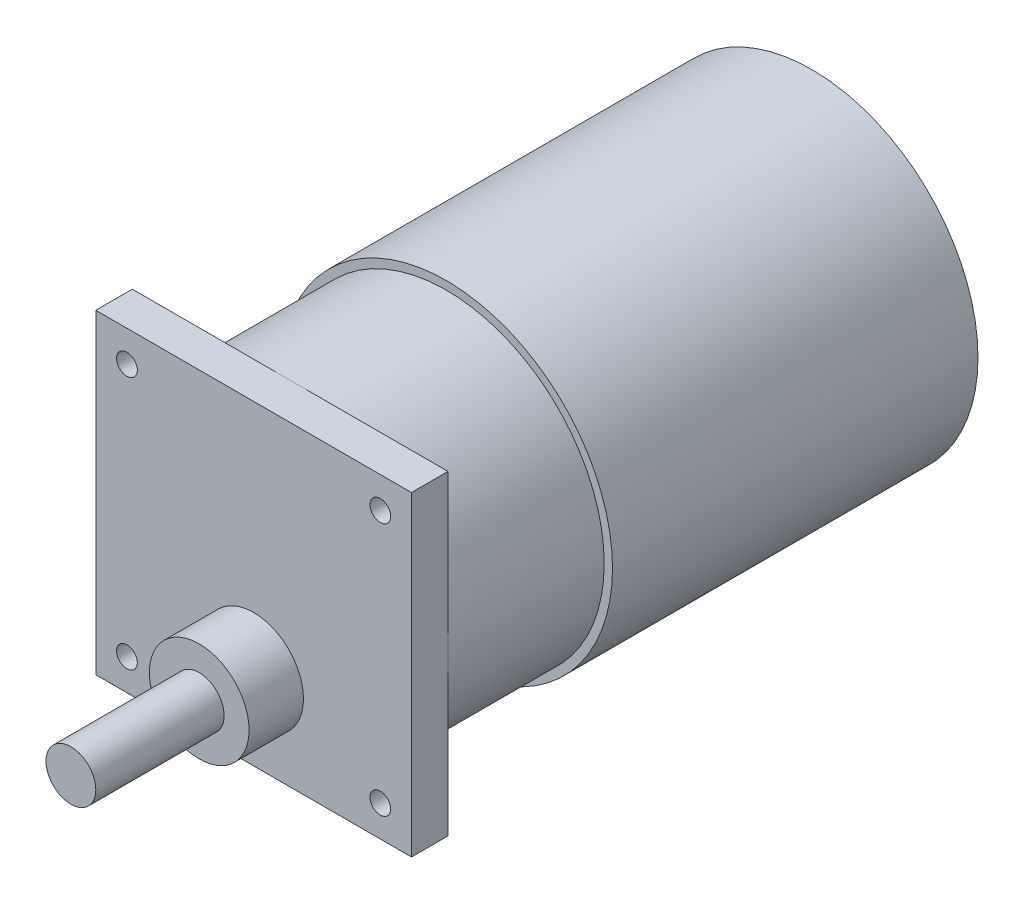
ISO-10303-21;
HEADER;
FILE_DESCRIPTION(('STEP AP214'),'2;1');
FILE_NAME('part.step','',(''),(''),'','','');
FILE_SCHEMA(('AUTOMOTIVE_DESIGN { 1 0 10303 214 1 1 1 1 }'));
ENDSEC;
DATA;
#1=APPLICATION_CONTEXT('core data for automotive mechanical design processes');
#2=APPLICATION_PROTOCOL_DEFINITION('international standard','automotive_design',2000,#1);
#3=PRODUCT_CONTEXT('',#1,'mechanical');
#4=PRODUCT('Part','Part','',(#3));
#5=PRODUCT_RELATED_PRODUCT_CATEGORY('part','',(#4));
#6=PRODUCT_DEFINITION_FORMATION('','',#4);
#7=PRODUCT_DEFINITION_CONTEXT('part definition',#1,'design');
#8=PRODUCT_DEFINITION('design','',#6,#7);
#9=PRODUCT_DEFINITION_SHAPE('','',#8);
#10=(LENGTH_UNIT() NAMED_UNIT(*) SI_UNIT(.MILLI.,.METRE.));
#11=(NAMED_UNIT(*) PLANE_ANGLE_UNIT() SI_UNIT($,.RADIAN.));
#12=(NAMED_UNIT(*) SI_UNIT($,.STERADIAN.) SOLID_ANGLE_UNIT());
#13=UNCERTAINTY_MEASURE_WITH_UNIT(LENGTH_MEASURE(1.E-05),#10,'distance_accuracy_value','');
#14=(GEOMETRIC_REPRESENTATION_CONTEXT(3) GLOBAL_UNCERTAINTY_ASSIGNED_CONTEXT((#13)) GLOBAL_UNIT_ASSIGNED_CONTEXT((#10,
#11,#12)) REPRESENTATION_CONTEXT('',''));
#15=CARTESIAN_POINT('',(0.,0.,0.));
#16=DIRECTION('',(0.,0.,1.));
#17=DIRECTION('',(1.,0.,0.));
#18=AXIS2_PLACEMENT_3D('',#15,#16,#17);
#19=CARTESIAN_POINT('',(0.,-9.,73.75));
#20=DIRECTION('',(0.,0.,1.));
#21=DIRECTION('',(1.,0.,0.));
#22=AXIS2_PLACEMENT_3D('',#19,#20,#21);
#23=PLANE('',#22);
#24=CARTESIAN_POINT('',(0.,-9.,73.75));
#25=DIRECTION('',(0.,0.,1.));
#26=DIRECTION('',(1.,0.,0.));
#27=AXIS2_PLACEMENT_3D('',#24,#25,#26);
#28=CIRCLE('',#27,6.);
#29=CARTESIAN_POINT('',(6.,-9.,73.75));
#30=VERTEX_POINT('',#29);
#31=EDGE_CURVE('E179',#30,#30,#28,.T.);
#32=ORIENTED_EDGE('',*,*,#31,.T.);
#33=EDGE_LOOP('',(#32));
#34=FACE_BOUND('',#33,.T.);
#35=CARTESIAN_POINT('',(0.,-9.,73.75));
#36=DIRECTION('',(0.,0.,1.));
#37=DIRECTION('',(1.,0.,0.));
#38=AXIS2_PLACEMENT_3D('',#35,#36,#37);
#39=CIRCLE('',#38,3.);
#40=CARTESIAN_POINT('',(3.,-9.,73.75));
#41=VERTEX_POINT('',#40);
#42=EDGE_CURVE('E186',#41,#41,#39,.T.);
#43=ORIENTED_EDGE('',*,*,#42,.F.);
#44=EDGE_LOOP('',(#43));
#45=FACE_BOUND('',#44,.T.);
#46=ADVANCED_FACE('F30',(#34,#45),#23,.T.);
#47=CARTESIAN_POINT('',(-19.,-19.,67.2));
#48=DIRECTION('',(0.,0.,1.));
#49=DIRECTION('',(1.,0.,0.));
#50=AXIS2_PLACEMENT_3D('',#47,#48,#49);
#51=PLANE('',#50);
#52=DIRECTION('',(0.,-1.,0.));
#53=VECTOR('',#52,1.);
#54=CARTESIAN_POINT('',(-19.,19.,67.2));
#55=LINE('',#54,#53);
#56=CARTESIAN_POINT('',(-19.,19.,67.2));
#57=VERTEX_POINT('',#56);
#58=CARTESIAN_POINT('',(-19.,-19.,67.2));
#59=VERTEX_POINT('',#58);
#60=EDGE_CURVE('E92',#57,#59,#55,.T.);
#61=ORIENTED_EDGE('',*,*,#60,.T.);
#62=DIRECTION('',(1.,0.,0.));
#63=VECTOR('',#62,1.);
#64=CARTESIAN_POINT('',(-19.,-19.,67.2));
#65=LINE('',#64,#63);
#66=CARTESIAN_POINT('',(19.,-19.,67.2));
#67=VERTEX_POINT('',#66);
#68=EDGE_CURVE('E81',#59,#67,#65,.T.);
#69=ORIENTED_EDGE('',*,*,#68,.T.);
#70=DIRECTION('',(0.,1.,0.));
#71=VECTOR('',#70,1.);
#72=CARTESIAN_POINT('',(19.,19.,67.2));
#73=LINE('',#72,#71);
#74=CARTESIAN_POINT('',(19.,19.,67.2));
#75=VERTEX_POINT('',#74);
#76=EDGE_CURVE('E91',#67,#75,#73,.T.);
#77=ORIENTED_EDGE('',*,*,#76,.T.);
#78=DIRECTION('',(-1.,0.,0.));
#79=VECTOR('',#78,1.);
#80=CARTESIAN_POINT('',(-19.,19.,67.2));
#81=LINE('',#80,#79);
#82=EDGE_CURVE('E98',#75,#57,#81,.T.);
#83=ORIENTED_EDGE('',*,*,#82,.T.);
#84=EDGE_LOOP('',(#61,#69,#77,#83));
#85=FACE_BOUND('',#84,.T.);
#86=CARTESIAN_POINT('',(-15.25,15.25,67.2));
#87=DIRECTION('',(0.,0.,1.));
#88=DIRECTION('',(1.,0.,0.));
#89=AXIS2_PLACEMENT_3D('',#86,#87,#88);
#90=CIRCLE('',#89,1.25);
#91=CARTESIAN_POINT('',(-14.,15.25,67.2));
#92=VERTEX_POINT('',#91);
#93=EDGE_CURVE('E158',#92,#92,#90,.T.);
#94=ORIENTED_EDGE('',*,*,#93,.F.);
#95=EDGE_LOOP('',(#94));
#96=FACE_BOUND('',#95,.T.);
#97=CARTESIAN_POINT('',(15.25,15.25,67.2));
#98=DIRECTION('',(0.,0.,1.));
#99=DIRECTION('',(1.,0.,0.));
#100=AXIS2_PLACEMENT_3D('',#97,#98,#99);
#101=CIRCLE('',#100,1.25);
#102=CARTESIAN_POINT('',(16.5,15.25,67.2));
#103=VERTEX_POINT('',#102);
#104=EDGE_CURVE('E164',#103,#103,#101,.T.);
#105=ORIENTED_EDGE('',*,*,#104,.F.);
#106=EDGE_LOOP('',(#105));
#107=FACE_BOUND('',#106,.T.);
#108=CARTESIAN_POINT('',(15.25,-15.25,67.2));
#109=DIRECTION('',(0.,0.,1.));
#110=DIRECTION('',(1.,0.,0.));
#111=AXIS2_PLACEMENT_3D('',#108,#109,#110);
#112=CIRCLE('',#111,1.25);
#113=CARTESIAN_POINT('',(16.5,-15.25,67.2));
#114=VERTEX_POINT('',#113);
#115=EDGE_CURVE('E170',#114,#114,#112,.T.);
#116=ORIENTED_EDGE('',*,*,#115,.F.);
#117=EDGE_LOOP('',(#116));
#118=FACE_BOUND('',#117,.T.);
#119=CARTESIAN_POINT('',(-15.25,-15.25,67.2));
#120=DIRECTION('',(0.,0.,1.));
#121=DIRECTION('',(1.,0.,0.));
#122=AXIS2_PLACEMENT_3D('',#119,#120,#121);
#123=CIRCLE('',#122,1.25);
#124=CARTESIAN_POINT('',(-14.,-15.25,67.2));
#125=VERTEX_POINT('',#124);
#126=EDGE_CURVE('E176',#125,#125,#123,.T.);
#127=ORIENTED_EDGE('',*,*,#126,.F.);
#128=EDGE_LOOP('',(#127));
#129=FACE_BOUND('',#128,.T.);
#130=CARTESIAN_POINT('',(0.,-9.,67.2));
#131=DIRECTION('',(0.,0.,1.));
#132=DIRECTION('',(1.,0.,0.));
#133=AXIS2_PLACEMENT_3D('',#130,#131,#132);
#134=CIRCLE('',#133,6.);
#135=CARTESIAN_POINT('',(6.,-9.,67.2));
#136=VERTEX_POINT('',#135);
#137=EDGE_CURVE('E180',#136,#136,#134,.T.);
#138=ORIENTED_EDGE('',*,*,#137,.F.);
#139=EDGE_LOOP('',(#138));
#140=FACE_BOUND('',#139,.T.);
#141=ADVANCED_FACE('F95',(#85,#96,#107,#118,#129,#140),#51,.T.);
#142=CARTESIAN_POINT('',(0.,0.,44.));
#143=DIRECTION('',(0.,0.,1.));
#144=DIRECTION('',(1.,0.,0.));
#145=AXIS2_PLACEMENT_3D('',#142,#143,#144);
#146=PLANE('',#145);
#147=CARTESIAN_POINT('',(0.,0.,44.));
#148=DIRECTION('',(0.,0.,1.));
#149=DIRECTION('',(1.,0.,0.));
#150=AXIS2_PLACEMENT_3D('',#147,#148,#149);
#151=CIRCLE('',#150,20.);
#152=CARTESIAN_POINT('',(20.,0.,44.));
#153=VERTEX_POINT('',#152);
#154=EDGE_CURVE('E11',#153,#153,#151,.T.);
#155=ORIENTED_EDGE('',*,*,#154,.T.);
#156=EDGE_LOOP('',(#155));
#157=FACE_BOUND('',#156,.T.);
#158=CARTESIAN_POINT('',(0.,0.,44.));
#159=DIRECTION('',(0.,0.,1.));
#160=DIRECTION('',(1.,0.,0.));
#161=AXIS2_PLACEMENT_3D('',#158,#159,#160);
#162=CIRCLE('',#161,19.);
#163=CARTESIAN_POINT('',(19.,0.,44.));
#164=VERTEX_POINT('',#163);
#165=EDGE_CURVE('E109',#164,#164,#162,.T.);
#166=ORIENTED_EDGE('',*,*,#165,.F.);
#167=EDGE_LOOP('',(#166));
#168=FACE_BOUND('',#167,.T.);
#169=ADVANCED_FACE('F207',(#157,#168),#146,.T.);
#170=CARTESIAN_POINT('',(0.,0.,44.));
#171=DIRECTION('',(0.,0.,-1.));
#172=DIRECTION('',(-1.,0.,0.));
#173=AXIS2_PLACEMENT_3D('',#170,#171,#172);
#174=CYLINDRICAL_SURFACE('',#173,20.);
#175=ORIENTED_EDGE('',*,*,#154,.F.);
#176=EDGE_LOOP('',(#175));
#177=FACE_BOUND('',#176,.T.);
#178=CARTESIAN_POINT('',(0.,0.,0.));
#179=DIRECTION('',(0.,0.,1.));
#180=DIRECTION('',(1.,0.,0.));
#181=AXIS2_PLACEMENT_3D('',#178,#179,#180);
#182=CIRCLE('',#181,20.);
#183=CARTESIAN_POINT('',(20.,0.,0.));
#184=VERTEX_POINT('',#183);
#185=EDGE_CURVE('E34',#184,#184,#182,.T.);
#186=ORIENTED_EDGE('',*,*,#185,.T.);
#187=EDGE_LOOP('',(#186));
#188=FACE_BOUND('',#187,.T.);
#189=ADVANCED_FACE('F32',(#177,#188),#174,.T.);
#190=CARTESIAN_POINT('',(0.,0.,0.));
#191=DIRECTION('',(0.,0.,1.));
#192=DIRECTION('',(1.,0.,0.));
#193=AXIS2_PLACEMENT_3D('',#190,#191,#192);
#194=PLANE('',#193);
#195=ORIENTED_EDGE('',*,*,#185,.F.);
#196=EDGE_LOOP('',(#195));
#197=FACE_BOUND('',#196,.T.);
#198=ADVANCED_FACE('F245',(#197),#194,.F.);
#199=CARTESIAN_POINT('',(0.,0.,62.8));
#200=DIRECTION('',(0.,0.,-1.));
#201=DIRECTION('',(-1.,0.,0.));
#202=AXIS2_PLACEMENT_3D('',#199,#200,#201);
#203=CYLINDRICAL_SURFACE('',#202,19.);
#204=CARTESIAN_POINT('',(0.,0.,62.8));
#205=DIRECTION('',(0.,0.,1.));
#206=DIRECTION('',(1.,0.,0.));
#207=AXIS2_PLACEMENT_3D('',#204,#205,#206);
#208=CIRCLE('',#207,19.);
#209=CARTESIAN_POINT('',(19.,0.,62.8));
#210=VERTEX_POINT('',#209);
#211=CARTESIAN_POINT('',(0.,19.,62.8));
#212=VERTEX_POINT('',#211);
#213=EDGE_CURVE('E117',#210,#212,#208,.T.);
#214=ORIENTED_EDGE('',*,*,#213,.F.);
#215=CARTESIAN_POINT('',(0.,-19.,62.8));
#216=VERTEX_POINT('',#215);
#217=EDGE_CURVE('E45',#216,#210,#208,.T.);
#218=ORIENTED_EDGE('',*,*,#217,.F.);
#219=CARTESIAN_POINT('',(-19.,0.,62.8));
#220=VERTEX_POINT('',#219);
#221=EDGE_CURVE('E49',#220,#216,#208,.T.);
#222=ORIENTED_EDGE('',*,*,#221,.F.);
#223=EDGE_CURVE('E119',#212,#220,#208,.T.);
#224=ORIENTED_EDGE('',*,*,#223,.F.);
#225=EDGE_LOOP('',(#214,#218,#222,#224));
#226=FACE_BOUND('',#225,.T.);
#227=ORIENTED_EDGE('',*,*,#165,.T.);
#228=EDGE_LOOP('',(#227));
#229=FACE_BOUND('',#228,.T.);
#230=ADVANCED_FACE('F233',(#226,#229),#203,.T.);
#231=CARTESIAN_POINT('',(-19.,-19.,62.8));
#232=DIRECTION('',(0.,0.,1.));
#233=DIRECTION('',(1.,0.,0.));
#234=AXIS2_PLACEMENT_3D('',#231,#232,#233);
#235=PLANE('',#234);
#236=CARTESIAN_POINT('',(15.25,15.25,62.8));
#237=DIRECTION('',(0.,0.,1.));
#238=DIRECTION('',(1.,0.,0.));
#239=AXIS2_PLACEMENT_3D('',#236,#237,#238);
#240=CIRCLE('',#239,1.25);
#241=CARTESIAN_POINT('',(16.5,15.25,62.8));
#242=VERTEX_POINT('',#241);
#243=EDGE_CURVE('E161',#242,#242,#240,.T.);
#244=ORIENTED_EDGE('',*,*,#243,.T.);
#245=EDGE_LOOP('',(#244));
#246=FACE_BOUND('',#245,.T.);
#247=DIRECTION('',(0.,1.,0.));
#248=VECTOR('',#247,1.);
#249=CARTESIAN_POINT('',(19.,19.,62.8));
#250=LINE('',#249,#248);
#251=CARTESIAN_POINT('',(19.,19.,62.8));
#252=VERTEX_POINT('',#251);
#253=EDGE_CURVE('E137',#210,#252,#250,.T.);
#254=ORIENTED_EDGE('',*,*,#253,.F.);
#255=ORIENTED_EDGE('',*,*,#213,.T.);
#256=DIRECTION('',(-1.,0.,0.));
#257=VECTOR('',#256,1.);
#258=CARTESIAN_POINT('',(-19.,19.,62.8));
#259=LINE('',#258,#257);
#260=EDGE_CURVE('E102',#252,#212,#259,.T.);
#261=ORIENTED_EDGE('',*,*,#260,.F.);
#262=EDGE_LOOP('',(#254,#255,#261));
#263=FACE_BOUND('',#262,.T.);
#264=ADVANCED_FACE('F151',(#246,#263),#235,.F.);
#265=CARTESIAN_POINT('',(-15.25,15.25,62.8));
#266=DIRECTION('',(0.,0.,1.));
#267=DIRECTION('',(1.,0.,0.));
#268=AXIS2_PLACEMENT_3D('',#265,#266,#267);
#269=CIRCLE('',#268,1.25);
#270=CARTESIAN_POINT('',(-14.,15.25,62.8));
#271=VERTEX_POINT('',#270);
#272=EDGE_CURVE('E155',#271,#271,#269,.T.);
#273=ORIENTED_EDGE('',*,*,#272,.T.);
#274=EDGE_LOOP('',(#273));
#275=FACE_BOUND('',#274,.T.);
#276=CARTESIAN_POINT('',(-19.,19.,62.8));
#277=VERTEX_POINT('',#276);
#278=EDGE_CURVE('E142',#212,#277,#259,.T.);
#279=ORIENTED_EDGE('',*,*,#278,.F.);
#280=ORIENTED_EDGE('',*,*,#223,.T.);
#281=DIRECTION('',(0.,-1.,0.));
#282=VECTOR('',#281,1.);
#283=CARTESIAN_POINT('',(-19.,19.,62.8));
#284=LINE('',#283,#282);
#285=EDGE_CURVE('E135',#277,#220,#284,.T.);
#286=ORIENTED_EDGE('',*,*,#285,.F.);
#287=EDGE_LOOP('',(#279,#280,#286));
#288=FACE_BOUND('',#287,.T.);
#289=ADVANCED_FACE('F232',(#275,#288),#235,.F.);
#290=CARTESIAN_POINT('',(-15.25,-15.25,62.8));
#291=DIRECTION('',(0.,0.,1.));
#292=DIRECTION('',(1.,0.,0.));
#293=AXIS2_PLACEMENT_3D('',#290,#291,#292);
#294=CIRCLE('',#293,1.25);
#295=CARTESIAN_POINT('',(-14.,-15.25,62.8));
#296=VERTEX_POINT('',#295);
#297=EDGE_CURVE('E173',#296,#296,#294,.T.);
#298=ORIENTED_EDGE('',*,*,#297,.T.);
#299=EDGE_LOOP('',(#298));
#300=FACE_BOUND('',#299,.T.);
#301=CARTESIAN_POINT('',(-19.,-19.,62.8));
#302=VERTEX_POINT('',#301);
#303=EDGE_CURVE('E107',#220,#302,#284,.T.);
#304=ORIENTED_EDGE('',*,*,#303,.F.);
#305=ORIENTED_EDGE('',*,*,#221,.T.);
#306=DIRECTION('',(1.,0.,0.));
#307=VECTOR('',#306,1.);
#308=CARTESIAN_POINT('',(-19.,-19.,62.8));
#309=LINE('',#308,#307);
#310=EDGE_CURVE('E130',#302,#216,#309,.T.);
#311=ORIENTED_EDGE('',*,*,#310,.F.);
#312=EDGE_LOOP('',(#304,#305,#311));
#313=FACE_BOUND('',#312,.T.);
#314=ADVANCED_FACE('F129',(#300,#313),#235,.F.);
#315=CARTESIAN_POINT('',(15.25,-15.25,62.8));
#316=DIRECTION('',(0.,0.,1.));
#317=DIRECTION('',(1.,0.,0.));
#318=AXIS2_PLACEMENT_3D('',#315,#316,#317);
#319=CIRCLE('',#318,1.25);
#320=CARTESIAN_POINT('',(16.5,-15.25,62.8));
#321=VERTEX_POINT('',#320);
#322=EDGE_CURVE('E167',#321,#321,#319,.T.);
#323=ORIENTED_EDGE('',*,*,#322,.T.);
#324=EDGE_LOOP('',(#323));
#325=FACE_BOUND('',#324,.T.);
#326=CARTESIAN_POINT('',(19.,-19.,62.8));
#327=VERTEX_POINT('',#326);
#328=EDGE_CURVE('E131',#216,#327,#309,.T.);
#329=ORIENTED_EDGE('',*,*,#328,.F.);
#330=ORIENTED_EDGE('',*,*,#217,.T.);
#331=EDGE_CURVE('E134',#327,#210,#250,.T.);
#332=ORIENTED_EDGE('',*,*,#331,.F.);
#333=EDGE_LOOP('',(#329,#330,#332));
#334=FACE_BOUND('',#333,.T.);
#335=ADVANCED_FACE('F132',(#325,#334),#235,.F.);
#336=CARTESIAN_POINT('',(-19.,19.,67.2));
#337=DIRECTION('',(1.,0.,0.));
#338=DIRECTION('',(0.,0.,-1.));
#339=AXIS2_PLACEMENT_3D('',#336,#337,#338);
#340=PLANE('',#339);
#341=ORIENTED_EDGE('',*,*,#285,.T.);
#342=ORIENTED_EDGE('',*,*,#303,.T.);
#343=DIRECTION('',(0.,0.,-1.));
#344=VECTOR('',#343,1.);
#345=CARTESIAN_POINT('',(-19.,-19.,67.2));
#346=LINE('',#345,#344);
#347=EDGE_CURVE('E86',#59,#302,#346,.T.);
#348=ORIENTED_EDGE('',*,*,#347,.F.);
#349=ORIENTED_EDGE('',*,*,#60,.F.);
#350=DIRECTION('',(0.,0.,-1.));
#351=VECTOR('',#350,1.);
#352=CARTESIAN_POINT('',(-19.,19.,67.2));
#353=LINE('',#352,#351);
#354=EDGE_CURVE('E145',#57,#277,#353,.T.);
#355=ORIENTED_EDGE('',*,*,#354,.T.);
#356=EDGE_LOOP('',(#341,#342,#348,#349,#355));
#357=FACE_BOUND('',#356,.T.);
#358=ADVANCED_FACE('F105',(#357),#340,.F.);
#359=CARTESIAN_POINT('',(-19.,-19.,67.2));
#360=DIRECTION('',(0.,1.,0.));
#361=DIRECTION('',(0.,0.,1.));
#362=AXIS2_PLACEMENT_3D('',#359,#360,#361);
#363=PLANE('',#362);
#364=ORIENTED_EDGE('',*,*,#310,.T.);
#365=ORIENTED_EDGE('',*,*,#328,.T.);
#366=DIRECTION('',(0.,0.,-1.));
#367=VECTOR('',#366,1.);
#368=CARTESIAN_POINT('',(19.,-19.,67.2));
#369=LINE('',#368,#367);
#370=EDGE_CURVE('E88',#67,#327,#369,.T.);
#371=ORIENTED_EDGE('',*,*,#370,.F.);
#372=ORIENTED_EDGE('',*,*,#68,.F.);
#373=ORIENTED_EDGE('',*,*,#347,.T.);
#374=EDGE_LOOP('',(#364,#365,#371,#372,#373));
#375=FACE_BOUND('',#374,.T.);
#376=ADVANCED_FACE('F84',(#375),#363,.F.);
#377=CARTESIAN_POINT('',(19.,19.,67.2));
#378=DIRECTION('',(-1.,0.,0.));
#379=DIRECTION('',(0.,0.,1.));
#380=AXIS2_PLACEMENT_3D('',#377,#378,#379);
#381=PLANE('',#380);
#382=ORIENTED_EDGE('',*,*,#331,.T.);
#383=ORIENTED_EDGE('',*,*,#253,.T.);
#384=DIRECTION('',(0.,0.,-1.));
#385=VECTOR('',#384,1.);
#386=CARTESIAN_POINT('',(19.,19.,67.2));
#387=LINE('',#386,#385);
#388=EDGE_CURVE('E113',#75,#252,#387,.T.);
#389=ORIENTED_EDGE('',*,*,#388,.F.);
#390=ORIENTED_EDGE('',*,*,#76,.F.);
#391=ORIENTED_EDGE('',*,*,#370,.T.);
#392=EDGE_LOOP('',(#382,#383,#389,#390,#391));
#393=FACE_BOUND('',#392,.T.);
#394=ADVANCED_FACE('F152',(#393),#381,.F.);
#395=CARTESIAN_POINT('',(-19.,19.,67.2));
#396=DIRECTION('',(0.,-1.,0.));
#397=DIRECTION('',(0.,0.,-1.));
#398=AXIS2_PLACEMENT_3D('',#395,#396,#397);
#399=PLANE('',#398);
#400=ORIENTED_EDGE('',*,*,#260,.T.);
#401=ORIENTED_EDGE('',*,*,#278,.T.);
#402=ORIENTED_EDGE('',*,*,#354,.F.);
#403=ORIENTED_EDGE('',*,*,#82,.F.);
#404=ORIENTED_EDGE('',*,*,#388,.T.);
#405=EDGE_LOOP('',(#400,#401,#402,#403,#404));
#406=FACE_BOUND('',#405,.T.);
#407=ADVANCED_FACE('F149',(#406),#399,.F.);
#408=CARTESIAN_POINT('',(-15.25,15.25,0.));
#409=DIRECTION('',(0.,0.,1.));
#410=DIRECTION('',(1.,0.,0.));
#411=AXIS2_PLACEMENT_3D('',#408,#409,#410);
#412=CYLINDRICAL_SURFACE('',#411,1.25);
#413=ORIENTED_EDGE('',*,*,#93,.T.);
#414=EDGE_LOOP('',(#413));
#415=FACE_BOUND('',#414,.T.);
#416=ORIENTED_EDGE('',*,*,#272,.F.);
#417=EDGE_LOOP('',(#416));
#418=FACE_BOUND('',#417,.T.);
#419=ADVANCED_FACE('F225',(#415,#418),#412,.F.);
#420=CARTESIAN_POINT('',(15.25,15.25,0.));
#421=DIRECTION('',(0.,0.,1.));
#422=DIRECTION('',(1.,0.,0.));
#423=AXIS2_PLACEMENT_3D('',#420,#421,#422);
#424=CYLINDRICAL_SURFACE('',#423,1.25);
#425=ORIENTED_EDGE('',*,*,#104,.T.);
#426=EDGE_LOOP('',(#425));
#427=FACE_BOUND('',#426,.T.);
#428=ORIENTED_EDGE('',*,*,#243,.F.);
#429=EDGE_LOOP('',(#428));
#430=FACE_BOUND('',#429,.T.);
#431=ADVANCED_FACE('F221',(#427,#430),#424,.F.);
#432=CARTESIAN_POINT('',(15.25,-15.25,0.));
#433=DIRECTION('',(0.,0.,1.));
#434=DIRECTION('',(1.,0.,0.));
#435=AXIS2_PLACEMENT_3D('',#432,#433,#434);
#436=CYLINDRICAL_SURFACE('',#435,1.25);
#437=ORIENTED_EDGE('',*,*,#115,.T.);
#438=EDGE_LOOP('',(#437));
#439=FACE_BOUND('',#438,.T.);
#440=ORIENTED_EDGE('',*,*,#322,.F.);
#441=EDGE_LOOP('',(#440));
#442=FACE_BOUND('',#441,.T.);
#443=ADVANCED_FACE('F217',(#439,#442),#436,.F.);
#444=CARTESIAN_POINT('',(-15.25,-15.25,0.));
#445=DIRECTION('',(0.,0.,1.));
#446=DIRECTION('',(1.,0.,0.));
#447=AXIS2_PLACEMENT_3D('',#444,#445,#446);
#448=CYLINDRICAL_SURFACE('',#447,1.25);
#449=ORIENTED_EDGE('',*,*,#126,.T.);
#450=EDGE_LOOP('',(#449));
#451=FACE_BOUND('',#450,.T.);
#452=ORIENTED_EDGE('',*,*,#297,.F.);
#453=EDGE_LOOP('',(#452));
#454=FACE_BOUND('',#453,.T.);
#455=ADVANCED_FACE('F213',(#451,#454),#448,.F.);
#456=CARTESIAN_POINT('',(0.,-9.,73.75));
#457=DIRECTION('',(0.,0.,-1.));
#458=DIRECTION('',(-1.,0.,0.));
#459=AXIS2_PLACEMENT_3D('',#456,#457,#458);
#460=CYLINDRICAL_SURFACE('',#459,6.);
#461=ORIENTED_EDGE('',*,*,#31,.F.);
#462=EDGE_LOOP('',(#461));
#463=FACE_BOUND('',#462,.T.);
#464=ORIENTED_EDGE('',*,*,#137,.T.);
#465=EDGE_LOOP('',(#464));
#466=FACE_BOUND('',#465,.T.);
#467=ADVANCED_FACE('F197',(#463,#466),#460,.T.);
#468=CARTESIAN_POINT('',(0.,-9.,89.2));
#469=DIRECTION('',(0.,0.,-1.));
#470=DIRECTION('',(-1.,0.,0.));
#471=AXIS2_PLACEMENT_3D('',#468,#469,#470);
#472=CYLINDRICAL_SURFACE('',#471,3.);
#473=CARTESIAN_POINT('',(0.,-9.,89.2));
#474=DIRECTION('',(0.,0.,1.));
#475=DIRECTION('',(1.,0.,0.));
#476=AXIS2_PLACEMENT_3D('',#473,#474,#475);
#477=CIRCLE('',#476,3.);
#478=CARTESIAN_POINT('',(3.,-9.,89.2));
#479=VERTEX_POINT('',#478);
#480=EDGE_CURVE('E183',#479,#479,#477,.T.);
#481=ORIENTED_EDGE('',*,*,#480,.F.);
#482=EDGE_LOOP('',(#481));
#483=FACE_BOUND('',#482,.T.);
#484=ORIENTED_EDGE('',*,*,#42,.T.);
#485=EDGE_LOOP('',(#484));
#486=FACE_BOUND('',#485,.T.);
#487=ADVANCED_FACE('F194',(#483,#486),#472,.T.);
#488=CARTESIAN_POINT('',(0.,-9.,89.2));
#489=DIRECTION('',(0.,0.,1.));
#490=DIRECTION('',(1.,0.,0.));
#491=AXIS2_PLACEMENT_3D('',#488,#489,#490);
#492=PLANE('',#491);
#493=ORIENTED_EDGE('',*,*,#480,.T.);
#494=EDGE_LOOP('',(#493));
#495=FACE_BOUND('',#494,.T.);
#496=ADVANCED_FACE('F192',(#495),#492,.T.);
#497=CLOSED_SHELL('',(#46,#141,#169,#189,#198,#230,#264,#289,#314,#335,#358,#376,#394,#407,#419,
#431,#443,#455,#467,#487,#496));
#498=MANIFOLD_SOLID_BREP('B2',#497);
#499=ADVANCED_BREP_SHAPE_REPRESENTATION('',(#18,#498),#14);
#500=SHAPE_DEFINITION_REPRESENTATION(#9,#499);
ENDSEC;
END-ISO-10303-21;
